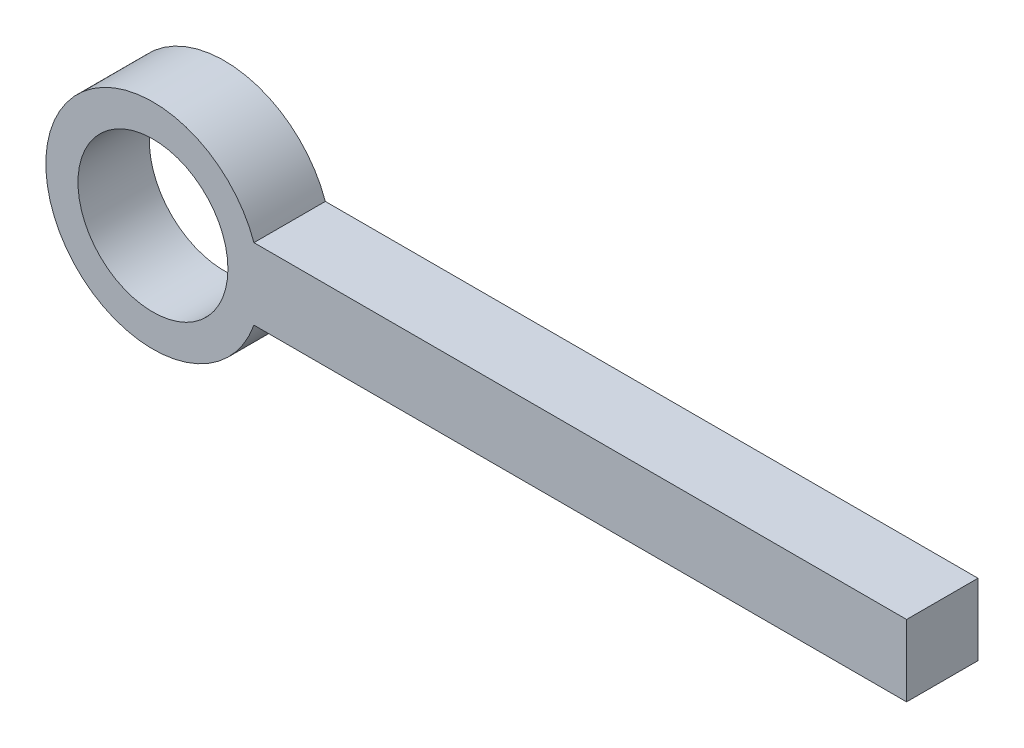
ISO-10303-21;
HEADER;
FILE_DESCRIPTION(('STEP AP214'),'2;1');
FILE_NAME('part.step','',(''),(''),'','','');
FILE_SCHEMA(('AUTOMOTIVE_DESIGN { 1 0 10303 214 1 1 1 1 }'));
ENDSEC;
DATA;
#1=APPLICATION_CONTEXT('core data for automotive mechanical design processes');
#2=APPLICATION_PROTOCOL_DEFINITION('international standard','automotive_design',2000,#1);
#3=PRODUCT_CONTEXT('',#1,'mechanical');
#4=PRODUCT('Part','Part','',(#3));
#5=PRODUCT_RELATED_PRODUCT_CATEGORY('part','',(#4));
#6=PRODUCT_DEFINITION_FORMATION('','',#4);
#7=PRODUCT_DEFINITION_CONTEXT('part definition',#1,'design');
#8=PRODUCT_DEFINITION('design','',#6,#7);
#9=PRODUCT_DEFINITION_SHAPE('','',#8);
#10=(LENGTH_UNIT() NAMED_UNIT(*) SI_UNIT(.MILLI.,.METRE.));
#11=(NAMED_UNIT(*) PLANE_ANGLE_UNIT() SI_UNIT($,.RADIAN.));
#12=(NAMED_UNIT(*) SI_UNIT($,.STERADIAN.) SOLID_ANGLE_UNIT());
#13=UNCERTAINTY_MEASURE_WITH_UNIT(LENGTH_MEASURE(1.E-05),#10,'distance_accuracy_value','');
#14=(GEOMETRIC_REPRESENTATION_CONTEXT(3) GLOBAL_UNCERTAINTY_ASSIGNED_CONTEXT((#13)) GLOBAL_UNIT_ASSIGNED_CONTEXT((#10,
#11,#12)) REPRESENTATION_CONTEXT('',''));
#15=CARTESIAN_POINT('',(0.,0.,0.));
#16=DIRECTION('',(0.,0.,1.));
#17=DIRECTION('',(1.,0.,0.));
#18=AXIS2_PLACEMENT_3D('',#15,#16,#17);
#19=CARTESIAN_POINT('',(-25.2404380129976,0.,10.));
#20=DIRECTION('',(0.,0.,1.));
#21=DIRECTION('',(1.,0.,0.));
#22=AXIS2_PLACEMENT_3D('',#19,#20,#21);
#23=PLANE('',#22);
#24=CARTESIAN_POINT('',(-25.2404380129976,0.,10.));
#25=DIRECTION('',(0.,0.,1.));
#26=DIRECTION('',(1.,0.,0.));
#27=AXIS2_PLACEMENT_3D('',#24,#25,#26);
#28=CIRCLE('',#27,15.);
#29=CARTESIAN_POINT('',(-11.0983023892667,5.,10.));
#30=VERTEX_POINT('',#29);
#31=CARTESIAN_POINT('',(-11.0983023892667,-5.,10.));
#32=VERTEX_POINT('',#31);
#33=EDGE_CURVE('E85',#30,#32,#28,.T.);
#34=ORIENTED_EDGE('',*,*,#33,.T.);
#35=DIRECTION('',(1.,0.,0.));
#36=VECTOR('',#35,1.);
#37=CARTESIAN_POINT('',(-11.0983023892667,-5.,10.));
#38=LINE('',#37,#36);
#39=CARTESIAN_POINT('',(80.2950846856434,-5.,10.));
#40=VERTEX_POINT('',#39);
#41=EDGE_CURVE('E80',#32,#40,#38,.T.);
#42=ORIENTED_EDGE('',*,*,#41,.T.);
#43=DIRECTION('',(0.,1.,0.));
#44=VECTOR('',#43,1.);
#45=CARTESIAN_POINT('',(80.2950846856434,-5.,10.));
#46=LINE('',#45,#44);
#47=CARTESIAN_POINT('',(80.2950846856434,5.,10.));
#48=VERTEX_POINT('',#47);
#49=EDGE_CURVE('E83',#40,#48,#46,.T.);
#50=ORIENTED_EDGE('',*,*,#49,.T.);
#51=DIRECTION('',(-1.,0.,0.));
#52=VECTOR('',#51,1.);
#53=CARTESIAN_POINT('',(80.2950846856434,5.,10.));
#54=LINE('',#53,#52);
#55=EDGE_CURVE('E50',#48,#30,#54,.T.);
#56=ORIENTED_EDGE('',*,*,#55,.T.);
#57=EDGE_LOOP('',(#34,#42,#50,#56));
#58=FACE_BOUND('',#57,.T.);
#59=CARTESIAN_POINT('',(-25.2404380129976,0.,10.));
#60=DIRECTION('',(0.,0.,1.));
#61=DIRECTION('',(1.,0.,0.));
#62=AXIS2_PLACEMENT_3D('',#59,#60,#61);
#63=CIRCLE('',#62,10.5);
#64=CARTESIAN_POINT('',(-14.7404380129976,0.,10.));
#65=VERTEX_POINT('',#64);
#66=EDGE_CURVE('E100',#65,#65,#63,.T.);
#67=ORIENTED_EDGE('',*,*,#66,.F.);
#68=EDGE_LOOP('',(#67));
#69=FACE_BOUND('',#68,.T.);
#70=ADVANCED_FACE('F33',(#58,#69),#23,.T.);
#71=CARTESIAN_POINT('',(-25.2404380129976,0.,0.));
#72=DIRECTION('',(0.,0.,1.));
#73=DIRECTION('',(1.,0.,0.));
#74=AXIS2_PLACEMENT_3D('',#71,#72,#73);
#75=PLANE('',#74);
#76=CARTESIAN_POINT('',(-25.2404380129976,0.,0.));
#77=DIRECTION('',(0.,0.,1.));
#78=DIRECTION('',(1.,0.,0.));
#79=AXIS2_PLACEMENT_3D('',#76,#77,#78);
#80=CIRCLE('',#79,15.);
#81=CARTESIAN_POINT('',(-11.0983023892667,5.,0.));
#82=VERTEX_POINT('',#81);
#83=CARTESIAN_POINT('',(-11.0983023892667,-5.,0.));
#84=VERTEX_POINT('',#83);
#85=EDGE_CURVE('E97',#82,#84,#80,.T.);
#86=ORIENTED_EDGE('',*,*,#85,.F.);
#87=DIRECTION('',(-1.,0.,0.));
#88=VECTOR('',#87,1.);
#89=CARTESIAN_POINT('',(80.2950846856434,5.,0.));
#90=LINE('',#89,#88);
#91=CARTESIAN_POINT('',(80.2950846856434,5.,0.));
#92=VERTEX_POINT('',#91);
#93=EDGE_CURVE('E73',#92,#82,#90,.T.);
#94=ORIENTED_EDGE('',*,*,#93,.F.);
#95=DIRECTION('',(0.,1.,0.));
#96=VECTOR('',#95,1.);
#97=CARTESIAN_POINT('',(80.2950846856434,-5.,0.));
#98=LINE('',#97,#96);
#99=CARTESIAN_POINT('',(80.2950846856434,-5.,0.));
#100=VERTEX_POINT('',#99);
#101=EDGE_CURVE('E67',#100,#92,#98,.T.);
#102=ORIENTED_EDGE('',*,*,#101,.F.);
#103=DIRECTION('',(1.,0.,0.));
#104=VECTOR('',#103,1.);
#105=CARTESIAN_POINT('',(-11.0983023892667,-5.,0.));
#106=LINE('',#105,#104);
#107=EDGE_CURVE('E89',#84,#100,#106,.T.);
#108=ORIENTED_EDGE('',*,*,#107,.F.);
#109=EDGE_LOOP('',(#86,#94,#102,#108));
#110=FACE_BOUND('',#109,.T.);
#111=CARTESIAN_POINT('',(-25.2404380129976,0.,0.));
#112=DIRECTION('',(0.,0.,1.));
#113=DIRECTION('',(1.,0.,0.));
#114=AXIS2_PLACEMENT_3D('',#111,#112,#113);
#115=CIRCLE('',#114,10.5);
#116=CARTESIAN_POINT('',(-14.7404380129976,0.,0.));
#117=VERTEX_POINT('',#116);
#118=EDGE_CURVE('E112',#117,#117,#115,.T.);
#119=ORIENTED_EDGE('',*,*,#118,.T.);
#120=EDGE_LOOP('',(#119));
#121=FACE_BOUND('',#120,.T.);
#122=ADVANCED_FACE('F108',(#110,#121),#75,.F.);
#123=CARTESIAN_POINT('',(-25.2404380129976,0.,10.));
#124=DIRECTION('',(0.,0.,-1.));
#125=DIRECTION('',(-1.,0.,0.));
#126=AXIS2_PLACEMENT_3D('',#123,#124,#125);
#127=CYLINDRICAL_SURFACE('',#126,15.);
#128=ORIENTED_EDGE('',*,*,#85,.T.);
#129=DIRECTION('',(0.,0.,-1.));
#130=VECTOR('',#129,1.);
#131=CARTESIAN_POINT('',(-11.0983023892667,-5.,10.));
#132=LINE('',#131,#130);
#133=EDGE_CURVE('E11',#32,#84,#132,.T.);
#134=ORIENTED_EDGE('',*,*,#133,.F.);
#135=ORIENTED_EDGE('',*,*,#33,.F.);
#136=DIRECTION('',(0.,0.,-1.));
#137=VECTOR('',#136,1.);
#138=CARTESIAN_POINT('',(-11.0983023892667,5.,10.));
#139=LINE('',#138,#137);
#140=EDGE_CURVE('E93',#30,#82,#139,.T.);
#141=ORIENTED_EDGE('',*,*,#140,.T.);
#142=EDGE_LOOP('',(#128,#134,#135,#141));
#143=FACE_BOUND('',#142,.T.);
#144=ADVANCED_FACE('F35',(#143),#127,.T.);
#145=CARTESIAN_POINT('',(-11.0983023892667,-5.,10.));
#146=DIRECTION('',(0.,1.,0.));
#147=DIRECTION('',(0.,0.,1.));
#148=AXIS2_PLACEMENT_3D('',#145,#146,#147);
#149=PLANE('',#148);
#150=ORIENTED_EDGE('',*,*,#107,.T.);
#151=DIRECTION('',(0.,0.,-1.));
#152=VECTOR('',#151,1.);
#153=CARTESIAN_POINT('',(80.2950846856434,-5.,10.));
#154=LINE('',#153,#152);
#155=EDGE_CURVE('E42',#40,#100,#154,.T.);
#156=ORIENTED_EDGE('',*,*,#155,.F.);
#157=ORIENTED_EDGE('',*,*,#41,.F.);
#158=ORIENTED_EDGE('',*,*,#133,.T.);
#159=EDGE_LOOP('',(#150,#156,#157,#158));
#160=FACE_BOUND('',#159,.T.);
#161=ADVANCED_FACE('F88',(#160),#149,.F.);
#162=CARTESIAN_POINT('',(80.2950846856434,-5.,10.));
#163=DIRECTION('',(-1.,0.,0.));
#164=DIRECTION('',(0.,0.,1.));
#165=AXIS2_PLACEMENT_3D('',#162,#163,#164);
#166=PLANE('',#165);
#167=ORIENTED_EDGE('',*,*,#101,.T.);
#168=DIRECTION('',(0.,0.,-1.));
#169=VECTOR('',#168,1.);
#170=CARTESIAN_POINT('',(80.2950846856434,5.,10.));
#171=LINE('',#170,#169);
#172=EDGE_CURVE('E90',#48,#92,#171,.T.);
#173=ORIENTED_EDGE('',*,*,#172,.F.);
#174=ORIENTED_EDGE('',*,*,#49,.F.);
#175=ORIENTED_EDGE('',*,*,#155,.T.);
#176=EDGE_LOOP('',(#167,#173,#174,#175));
#177=FACE_BOUND('',#176,.T.);
#178=ADVANCED_FACE('F91',(#177),#166,.F.);
#179=CARTESIAN_POINT('',(80.2950846856434,5.,10.));
#180=DIRECTION('',(0.,-1.,0.));
#181=DIRECTION('',(0.,0.,-1.));
#182=AXIS2_PLACEMENT_3D('',#179,#180,#181);
#183=PLANE('',#182);
#184=ORIENTED_EDGE('',*,*,#93,.T.);
#185=ORIENTED_EDGE('',*,*,#140,.F.);
#186=ORIENTED_EDGE('',*,*,#55,.F.);
#187=ORIENTED_EDGE('',*,*,#172,.T.);
#188=EDGE_LOOP('',(#184,#185,#186,#187));
#189=FACE_BOUND('',#188,.T.);
#190=ADVANCED_FACE('F105',(#189),#183,.F.);
#191=CARTESIAN_POINT('',(-25.2404380129976,0.,10.));
#192=DIRECTION('',(0.,0.,-1.));
#193=DIRECTION('',(-1.,0.,0.));
#194=AXIS2_PLACEMENT_3D('',#191,#192,#193);
#195=CYLINDRICAL_SURFACE('',#194,10.5);
#196=ORIENTED_EDGE('',*,*,#66,.T.);
#197=EDGE_LOOP('',(#196));
#198=FACE_BOUND('',#197,.T.);
#199=ORIENTED_EDGE('',*,*,#118,.F.);
#200=EDGE_LOOP('',(#199));
#201=FACE_BOUND('',#200,.T.);
#202=ADVANCED_FACE('F118',(#198,#201),#195,.F.);
#203=CLOSED_SHELL('',(#70,#122,#144,#161,#178,#190,#202));
#204=MANIFOLD_SOLID_BREP('B2',#203);
#205=ADVANCED_BREP_SHAPE_REPRESENTATION('',(#18,#204),#14);
#206=SHAPE_DEFINITION_REPRESENTATION(#9,#205);
ENDSEC;
END-ISO-10303-21;
